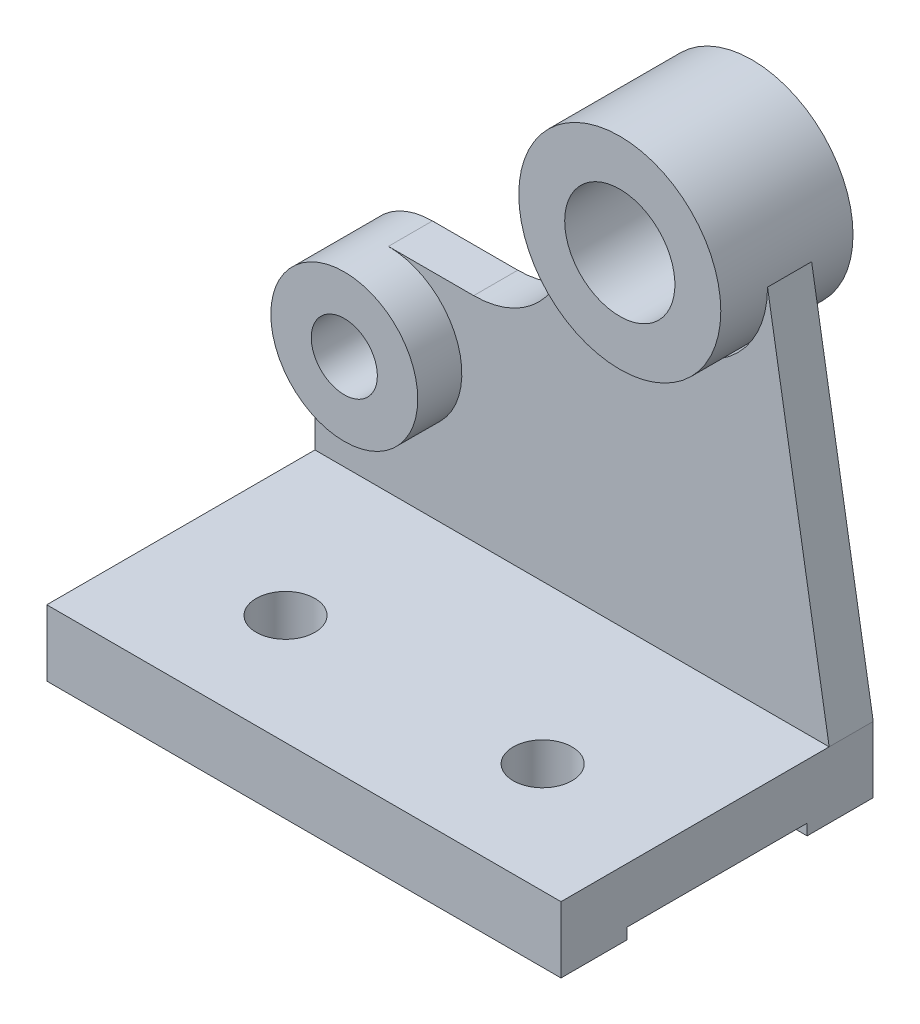
ISO-10303-21;
HEADER;
FILE_DESCRIPTION(('STEP AP214'),'2;1');
FILE_NAME('part.step','',(''),(''),'','','');
FILE_SCHEMA(('AUTOMOTIVE_DESIGN { 1 0 10303 214 1 1 1 1 }'));
ENDSEC;
DATA;
#1=APPLICATION_CONTEXT('core data for automotive mechanical design processes');
#2=APPLICATION_PROTOCOL_DEFINITION('international standard','automotive_design',2000,#1);
#3=PRODUCT_CONTEXT('',#1,'mechanical');
#4=PRODUCT('Part','Part','',(#3));
#5=PRODUCT_RELATED_PRODUCT_CATEGORY('part','',(#4));
#6=PRODUCT_DEFINITION_FORMATION('','',#4);
#7=PRODUCT_DEFINITION_CONTEXT('part definition',#1,'design');
#8=PRODUCT_DEFINITION('design','',#6,#7);
#9=PRODUCT_DEFINITION_SHAPE('','',#8);
#10=(LENGTH_UNIT() NAMED_UNIT(*) SI_UNIT(.MILLI.,.METRE.));
#11=(NAMED_UNIT(*) PLANE_ANGLE_UNIT() SI_UNIT($,.RADIAN.));
#12=(NAMED_UNIT(*) SI_UNIT($,.STERADIAN.) SOLID_ANGLE_UNIT());
#13=UNCERTAINTY_MEASURE_WITH_UNIT(LENGTH_MEASURE(1.E-05),#10,'distance_accuracy_value','');
#14=(GEOMETRIC_REPRESENTATION_CONTEXT(3) GLOBAL_UNCERTAINTY_ASSIGNED_CONTEXT((#13)) GLOBAL_UNIT_ASSIGNED_CONTEXT((#10,
#11,#12)) REPRESENTATION_CONTEXT('',''));
#15=CARTESIAN_POINT('',(0.,0.,0.));
#16=DIRECTION('',(0.,0.,1.));
#17=DIRECTION('',(1.,0.,0.));
#18=AXIS2_PLACEMENT_3D('',#15,#16,#17);
#19=CARTESIAN_POINT('',(0.,0.,85.));
#20=DIRECTION('',(0.,1.,0.));
#21=DIRECTION('',(0.,0.,1.));
#22=AXIS2_PLACEMENT_3D('',#19,#20,#21);
#23=PLANE('',#22);
#24=DIRECTION('',(0.,0.,-1.));
#25=VECTOR('',#24,1.);
#26=CARTESIAN_POINT('',(140.,0.,85.));
#27=LINE('',#26,#25);
#28=CARTESIAN_POINT('',(140.,0.,18.));
#29=VERTEX_POINT('',#28);
#30=CARTESIAN_POINT('',(140.,0.,0.));
#31=VERTEX_POINT('',#30);
#32=EDGE_CURVE('E174',#29,#31,#27,.T.);
#33=ORIENTED_EDGE('',*,*,#32,.F.);
#34=DIRECTION('',(-1.,0.,0.));
#35=VECTOR('',#34,1.);
#36=CARTESIAN_POINT('',(140.,0.,18.));
#37=LINE('',#36,#35);
#38=CARTESIAN_POINT('',(0.,0.,18.));
#39=VERTEX_POINT('',#38);
#40=EDGE_CURVE('E313',#29,#39,#37,.T.);
#41=ORIENTED_EDGE('',*,*,#40,.T.);
#42=DIRECTION('',(0.,0.,-1.));
#43=VECTOR('',#42,1.);
#44=CARTESIAN_POINT('',(0.,0.,85.));
#45=LINE('',#44,#43);
#46=CARTESIAN_POINT('',(0.,0.,0.));
#47=VERTEX_POINT('',#46);
#48=EDGE_CURVE('E293',#39,#47,#45,.T.);
#49=ORIENTED_EDGE('',*,*,#48,.T.);
#50=DIRECTION('',(1.,0.,0.));
#51=VECTOR('',#50,1.);
#52=CARTESIAN_POINT('',(0.,0.,0.));
#53=LINE('',#52,#51);
#54=EDGE_CURVE('E278',#47,#31,#53,.T.);
#55=ORIENTED_EDGE('',*,*,#54,.T.);
#56=EDGE_LOOP('',(#33,#41,#49,#55));
#57=FACE_BOUND('',#56,.T.);
#58=ADVANCED_FACE('F37',(#57),#23,.F.);
#59=CARTESIAN_POINT('',(95.728006970458,118.,12.));
#60=DIRECTION('',(0.,0.,-1.));
#61=DIRECTION('',(-1.,0.,0.));
#62=AXIS2_PLACEMENT_3D('',#59,#60,#61);
#63=CYLINDRICAL_SURFACE('',#62,27.5);
#64=CARTESIAN_POINT('',(95.728006970458,118.,0.));
#65=DIRECTION('',(0.,0.,1.));
#66=DIRECTION('',(1.,0.,0.));
#67=AXIS2_PLACEMENT_3D('',#64,#65,#66);
#68=CIRCLE('',#67,27.5);
#69=CARTESIAN_POINT('',(95.36400348523,90.5024091698429,0.));
#70=VERTEX_POINT('',#69);
#71=CARTESIAN_POINT('',(123.228006970458,118.,0.));
#72=VERTEX_POINT('',#71);
#73=EDGE_CURVE('E225',#70,#72,#68,.T.);
#74=ORIENTED_EDGE('',*,*,#73,.F.);
#75=DIRECTION('',(0.,0.,1.));
#76=VECTOR('',#75,1.);
#77=CARTESIAN_POINT('',(95.36400348523,90.5024091698429,6.));
#78=LINE('',#77,#76);
#79=CARTESIAN_POINT('',(95.36400348523,90.5024091698429,12.));
#80=VERTEX_POINT('',#79);
#81=EDGE_CURVE('E272',#70,#80,#78,.T.);
#82=ORIENTED_EDGE('',*,*,#81,.T.);
#83=CARTESIAN_POINT('',(95.728006970458,118.,12.));
#84=DIRECTION('',(0.,0.,1.));
#85=DIRECTION('',(1.,0.,0.));
#86=AXIS2_PLACEMENT_3D('',#83,#84,#85);
#87=CIRCLE('',#86,27.5);
#88=CARTESIAN_POINT('',(123.228006970458,118.,12.));
#89=VERTEX_POINT('',#88);
#90=EDGE_CURVE('E209',#80,#89,#87,.T.);
#91=ORIENTED_EDGE('',*,*,#90,.T.);
#92=DIRECTION('',(0.,0.,-1.));
#93=VECTOR('',#92,1.);
#94=CARTESIAN_POINT('',(123.228006970458,118.,12.));
#95=LINE('',#94,#93);
#96=EDGE_CURVE('E230',#89,#72,#95,.T.);
#97=ORIENTED_EDGE('',*,*,#96,.T.);
#98=EDGE_LOOP('',(#74,#82,#91,#97));
#99=FACE_BOUND('',#98,.T.);
#100=ADVANCED_FACE('F271',(#99),#63,.F.);
#101=CARTESIAN_POINT('',(68.228006970458,0.,12.));
#102=DIRECTION('',(1.,0.,0.));
#103=DIRECTION('',(0.,0.,-1.));
#104=AXIS2_PLACEMENT_3D('',#101,#102,#103);
#105=PLANE('',#104);
#106=DIRECTION('',(0.,0.,1.));
#107=VECTOR('',#106,1.);
#108=CARTESIAN_POINT('',(68.228006970458,111.714270986898,-12.));
#109=LINE('',#108,#107);
#110=CARTESIAN_POINT('',(68.228006970458,111.714270986898,0.));
#111=VERTEX_POINT('',#110);
#112=CARTESIAN_POINT('',(68.228006970458,111.714270986898,12.));
#113=VERTEX_POINT('',#112);
#114=EDGE_CURVE('E266',#111,#113,#109,.T.);
#115=ORIENTED_EDGE('',*,*,#114,.F.);
#116=DIRECTION('',(0.,-1.,0.));
#117=VECTOR('',#116,1.);
#118=CARTESIAN_POINT('',(68.228006970458,0.,0.));
#119=LINE('',#118,#117);
#120=CARTESIAN_POINT('',(68.228006970458,101.,0.));
#121=VERTEX_POINT('',#120);
#122=EDGE_CURVE('E195',#111,#121,#119,.T.);
#123=ORIENTED_EDGE('',*,*,#122,.T.);
#124=DIRECTION('',(0.,0.,-1.));
#125=VECTOR('',#124,1.);
#126=CARTESIAN_POINT('',(68.228006970458,101.,12.));
#127=LINE('',#126,#125);
#128=CARTESIAN_POINT('',(68.228006970458,101.,12.));
#129=VERTEX_POINT('',#128);
#130=EDGE_CURVE('E213',#129,#121,#127,.T.);
#131=ORIENTED_EDGE('',*,*,#130,.F.);
#132=DIRECTION('',(0.,-1.,0.));
#133=VECTOR('',#132,1.);
#134=CARTESIAN_POINT('',(68.228006970458,0.,12.));
#135=LINE('',#134,#133);
#136=EDGE_CURVE('E211',#113,#129,#135,.T.);
#137=ORIENTED_EDGE('',*,*,#136,.F.);
#138=EDGE_LOOP('',(#115,#123,#131,#137));
#139=FACE_BOUND('',#138,.T.);
#140=ADVANCED_FACE('F265',(#139),#105,.F.);
#141=CARTESIAN_POINT('',(43.228006970458,101.,12.));
#142=DIRECTION('',(0.,0.,-1.));
#143=DIRECTION('',(-1.,0.,0.));
#144=AXIS2_PLACEMENT_3D('',#141,#142,#143);
#145=CYLINDRICAL_SURFACE('',#144,25.);
#146=CARTESIAN_POINT('',(43.228006970458,101.,0.));
#147=DIRECTION('',(0.,0.,1.));
#148=DIRECTION('',(1.,0.,0.));
#149=AXIS2_PLACEMENT_3D('',#146,#147,#148);
#150=CIRCLE('',#149,25.);
#151=CARTESIAN_POINT('',(43.228006970458,76.,0.));
#152=VERTEX_POINT('',#151);
#153=EDGE_CURVE('E188',#152,#121,#150,.T.);
#154=ORIENTED_EDGE('',*,*,#153,.F.);
#155=DIRECTION('',(0.,0.,-1.));
#156=VECTOR('',#155,1.);
#157=CARTESIAN_POINT('',(43.228006970458,76.,12.));
#158=LINE('',#157,#156);
#159=CARTESIAN_POINT('',(43.228006970458,76.,12.));
#160=VERTEX_POINT('',#159);
#161=EDGE_CURVE('E46',#160,#152,#158,.T.);
#162=ORIENTED_EDGE('',*,*,#161,.F.);
#163=CARTESIAN_POINT('',(43.228006970458,101.,12.));
#164=DIRECTION('',(0.,0.,1.));
#165=DIRECTION('',(1.,0.,0.));
#166=AXIS2_PLACEMENT_3D('',#163,#164,#165);
#167=CIRCLE('',#166,25.);
#168=EDGE_CURVE('E191',#160,#129,#167,.T.);
#169=ORIENTED_EDGE('',*,*,#168,.T.);
#170=ORIENTED_EDGE('',*,*,#130,.T.);
#171=EDGE_LOOP('',(#154,#162,#169,#170));
#172=FACE_BOUND('',#171,.T.);
#173=ADVANCED_FACE('F39',(#172),#145,.F.);
#174=CARTESIAN_POINT('',(0.,76.,12.));
#175=DIRECTION('',(0.,1.,0.));
#176=DIRECTION('',(0.,0.,1.));
#177=AXIS2_PLACEMENT_3D('',#174,#175,#176);
#178=PLANE('',#177);
#179=DIRECTION('',(1.,0.,0.));
#180=VECTOR('',#179,1.);
#181=CARTESIAN_POINT('',(0.,76.,0.));
#182=LINE('',#181,#180);
#183=CARTESIAN_POINT('',(20.,76.,0.));
#184=VERTEX_POINT('',#183);
#185=EDGE_CURVE('E216',#184,#152,#182,.T.);
#186=ORIENTED_EDGE('',*,*,#185,.F.);
#187=DIRECTION('',(0.,0.,-1.));
#188=VECTOR('',#187,1.);
#189=CARTESIAN_POINT('',(20.,76.,12.));
#190=LINE('',#189,#188);
#191=CARTESIAN_POINT('',(20.,76.,12.));
#192=VERTEX_POINT('',#191);
#193=EDGE_CURVE('E239',#192,#184,#190,.T.);
#194=ORIENTED_EDGE('',*,*,#193,.F.);
#195=DIRECTION('',(1.,0.,0.));
#196=VECTOR('',#195,1.);
#197=CARTESIAN_POINT('',(0.,76.,12.));
#198=LINE('',#197,#196);
#199=EDGE_CURVE('E194',#192,#160,#198,.T.);
#200=ORIENTED_EDGE('',*,*,#199,.T.);
#201=ORIENTED_EDGE('',*,*,#161,.T.);
#202=EDGE_LOOP('',(#186,#194,#200,#201));
#203=FACE_BOUND('',#202,.T.);
#204=ADVANCED_FACE('F245',(#203),#178,.T.);
#205=CARTESIAN_POINT('',(0.,0.,12.));
#206=DIRECTION('',(-1.,0.,0.));
#207=DIRECTION('',(0.,0.,1.));
#208=AXIS2_PLACEMENT_3D('',#205,#206,#207);
#209=PLANE('',#208);
#210=DIRECTION('',(0.,-1.,0.));
#211=VECTOR('',#210,1.);
#212=CARTESIAN_POINT('',(0.,0.,18.));
#213=LINE('',#212,#211);
#214=CARTESIAN_POINT('',(0.,3.,18.));
#215=VERTEX_POINT('',#214);
#216=EDGE_CURVE('E157',#215,#39,#213,.T.);
#217=ORIENTED_EDGE('',*,*,#216,.F.);
#218=DIRECTION('',(0.,0.,-1.));
#219=VECTOR('',#218,1.);
#220=CARTESIAN_POINT('',(0.,3.,18.));
#221=LINE('',#220,#219);
#222=CARTESIAN_POINT('',(0.,3.,67.));
#223=VERTEX_POINT('',#222);
#224=EDGE_CURVE('E388',#223,#215,#221,.T.);
#225=ORIENTED_EDGE('',*,*,#224,.F.);
#226=DIRECTION('',(0.,1.,0.));
#227=VECTOR('',#226,1.);
#228=CARTESIAN_POINT('',(0.,3.,67.));
#229=LINE('',#228,#227);
#230=CARTESIAN_POINT('',(0.,0.,67.));
#231=VERTEX_POINT('',#230);
#232=EDGE_CURVE('E390',#231,#223,#229,.T.);
#233=ORIENTED_EDGE('',*,*,#232,.F.);
#234=CARTESIAN_POINT('',(0.,0.,85.));
#235=VERTEX_POINT('',#234);
#236=EDGE_CURVE('E166',#235,#231,#45,.T.);
#237=ORIENTED_EDGE('',*,*,#236,.F.);
#238=DIRECTION('',(0.,-1.,0.));
#239=VECTOR('',#238,1.);
#240=CARTESIAN_POINT('',(0.,0.,85.));
#241=LINE('',#240,#239);
#242=CARTESIAN_POINT('',(0.,18.,85.));
#243=VERTEX_POINT('',#242);
#244=EDGE_CURVE('E291',#243,#235,#241,.T.);
#245=ORIENTED_EDGE('',*,*,#244,.F.);
#246=DIRECTION('',(0.,0.,-1.));
#247=VECTOR('',#246,1.);
#248=CARTESIAN_POINT('',(0.,18.,85.));
#249=LINE('',#248,#247);
#250=CARTESIAN_POINT('',(0.,18.,12.));
#251=VERTEX_POINT('',#250);
#252=EDGE_CURVE('E297',#243,#251,#249,.T.);
#253=ORIENTED_EDGE('',*,*,#252,.T.);
#254=DIRECTION('',(0.,1.,0.));
#255=VECTOR('',#254,1.);
#256=CARTESIAN_POINT('',(0.,0.,12.));
#257=LINE('',#256,#255);
#258=CARTESIAN_POINT('',(0.,56.,12.));
#259=VERTEX_POINT('',#258);
#260=EDGE_CURVE('E200',#251,#259,#257,.T.);
#261=ORIENTED_EDGE('',*,*,#260,.T.);
#262=DIRECTION('',(0.,0.,-1.));
#263=VECTOR('',#262,1.);
#264=CARTESIAN_POINT('',(0.,56.,12.));
#265=LINE('',#264,#263);
#266=CARTESIAN_POINT('',(0.,56.,0.));
#267=VERTEX_POINT('',#266);
#268=EDGE_CURVE('E236',#259,#267,#265,.T.);
#269=ORIENTED_EDGE('',*,*,#268,.T.);
#270=DIRECTION('',(0.,1.,0.));
#271=VECTOR('',#270,1.);
#272=CARTESIAN_POINT('',(0.,0.,0.));
#273=LINE('',#272,#271);
#274=EDGE_CURVE('E219',#47,#267,#273,.T.);
#275=ORIENTED_EDGE('',*,*,#274,.F.);
#276=ORIENTED_EDGE('',*,*,#48,.F.);
#277=EDGE_LOOP('',(#217,#225,#233,#237,#245,#253,#261,#269,#275,#276));
#278=FACE_BOUND('',#277,.T.);
#279=ADVANCED_FACE('F315',(#278),#209,.T.);
#280=CARTESIAN_POINT('',(139.105912890801,23.330834013726,12.));
#281=DIRECTION('',(0.986224959312359,0.165409581431473,0.));
#282=DIRECTION('',(-0.165409581431473,0.98622495931236,0.));
#283=AXIS2_PLACEMENT_3D('',#280,#281,#282);
#284=PLANE('',#283);
#285=DIRECTION('',(0.165409581431473,-0.986224959312359,0.));
#286=VECTOR('',#285,1.);
#287=CARTESIAN_POINT('',(139.105912890801,23.330834013726,0.));
#288=LINE('',#287,#286);
#289=CARTESIAN_POINT('',(140.,18.,0.));
#290=VERTEX_POINT('',#289);
#291=EDGE_CURVE('E222',#72,#290,#288,.T.);
#292=ORIENTED_EDGE('',*,*,#291,.F.);
#293=ORIENTED_EDGE('',*,*,#96,.F.);
#294=DIRECTION('',(0.165409581431473,-0.986224959312359,0.));
#295=VECTOR('',#294,1.);
#296=CARTESIAN_POINT('',(139.105912890801,23.330834013726,12.));
#297=LINE('',#296,#295);
#298=CARTESIAN_POINT('',(140.,18.,12.));
#299=VERTEX_POINT('',#298);
#300=EDGE_CURVE('E206',#89,#299,#297,.T.);
#301=ORIENTED_EDGE('',*,*,#300,.T.);
#302=DIRECTION('',(0.,0.,-1.));
#303=VECTOR('',#302,1.);
#304=CARTESIAN_POINT('',(140.,18.,12.));
#305=LINE('',#304,#303);
#306=EDGE_CURVE('E233',#299,#290,#305,.T.);
#307=ORIENTED_EDGE('',*,*,#306,.T.);
#308=EDGE_LOOP('',(#292,#293,#301,#307));
#309=FACE_BOUND('',#308,.T.);
#310=ADVANCED_FACE('F308',(#309),#284,.T.);
#311=CARTESIAN_POINT('',(0.,0.,12.));
#312=DIRECTION('',(0.,0.,1.));
#313=DIRECTION('',(1.,0.,0.));
#314=AXIS2_PLACEMENT_3D('',#311,#312,#313);
#315=PLANE('',#314);
#316=ORIENTED_EDGE('',*,*,#90,.F.);
#317=CARTESIAN_POINT('',(95.,118.,12.));
#318=DIRECTION('',(0.,0.,1.));
#319=DIRECTION('',(1.,0.,0.));
#320=AXIS2_PLACEMENT_3D('',#317,#318,#319);
#321=CIRCLE('',#320,27.5);
#322=EDGE_CURVE('E61',#80,#113,#321,.F.);
#323=ORIENTED_EDGE('',*,*,#322,.T.);
#324=ORIENTED_EDGE('',*,*,#136,.T.);
#325=ORIENTED_EDGE('',*,*,#168,.F.);
#326=ORIENTED_EDGE('',*,*,#199,.F.);
#327=CARTESIAN_POINT('',(20.,56.,12.));
#328=DIRECTION('',(0.,0.,1.));
#329=DIRECTION('',(1.,0.,0.));
#330=AXIS2_PLACEMENT_3D('',#327,#328,#329);
#331=CIRCLE('',#330,20.);
#332=EDGE_CURVE('E198',#259,#192,#331,.T.);
#333=ORIENTED_EDGE('',*,*,#332,.F.);
#334=ORIENTED_EDGE('',*,*,#260,.F.);
#335=DIRECTION('',(1.,0.,0.));
#336=VECTOR('',#335,1.);
#337=CARTESIAN_POINT('',(0.,18.,12.));
#338=LINE('',#337,#336);
#339=EDGE_CURVE('E203',#251,#299,#338,.T.);
#340=ORIENTED_EDGE('',*,*,#339,.T.);
#341=ORIENTED_EDGE('',*,*,#300,.F.);
#342=EDGE_LOOP('',(#316,#323,#324,#325,#326,#333,#334,#340,#341));
#343=FACE_BOUND('',#342,.T.);
#344=ADVANCED_FACE('F260',(#343),#315,.T.);
#345=CARTESIAN_POINT('',(0.,0.,0.));
#346=DIRECTION('',(0.,0.,1.));
#347=DIRECTION('',(1.,0.,0.));
#348=AXIS2_PLACEMENT_3D('',#345,#346,#347);
#349=PLANE('',#348);
#350=CARTESIAN_POINT('',(95.,118.,0.));
#351=DIRECTION('',(0.,0.,1.));
#352=DIRECTION('',(1.,0.,0.));
#353=AXIS2_PLACEMENT_3D('',#350,#351,#352);
#354=CIRCLE('',#353,27.5);
#355=EDGE_CURVE('E11',#70,#111,#354,.F.);
#356=ORIENTED_EDGE('',*,*,#355,.F.);
#357=ORIENTED_EDGE('',*,*,#73,.T.);
#358=ORIENTED_EDGE('',*,*,#291,.T.);
#359=DIRECTION('',(0.,1.,0.));
#360=VECTOR('',#359,1.);
#361=CARTESIAN_POINT('',(140.,0.,0.));
#362=LINE('',#361,#360);
#363=EDGE_CURVE('E286',#31,#290,#362,.T.);
#364=ORIENTED_EDGE('',*,*,#363,.F.);
#365=ORIENTED_EDGE('',*,*,#54,.F.);
#366=ORIENTED_EDGE('',*,*,#274,.T.);
#367=CARTESIAN_POINT('',(20.,56.,0.));
#368=DIRECTION('',(0.,0.,1.));
#369=DIRECTION('',(1.,0.,0.));
#370=AXIS2_PLACEMENT_3D('',#367,#368,#369);
#371=CIRCLE('',#370,20.);
#372=EDGE_CURVE('E177',#184,#267,#371,.T.);
#373=ORIENTED_EDGE('',*,*,#372,.F.);
#374=ORIENTED_EDGE('',*,*,#185,.T.);
#375=ORIENTED_EDGE('',*,*,#153,.T.);
#376=ORIENTED_EDGE('',*,*,#122,.F.);
#377=EDGE_LOOP('',(#356,#357,#358,#364,#365,#366,#373,#374,#375,#376));
#378=FACE_BOUND('',#377,.T.);
#379=CARTESIAN_POINT('',(20.,56.,0.));
#380=DIRECTION('',(0.,0.,1.));
#381=DIRECTION('',(1.,0.,0.));
#382=AXIS2_PLACEMENT_3D('',#379,#380,#381);
#383=CIRCLE('',#382,9.);
#384=CARTESIAN_POINT('',(29.,56.,0.));
#385=VERTEX_POINT('',#384);
#386=EDGE_CURVE('E173',#385,#385,#383,.T.);
#387=ORIENTED_EDGE('',*,*,#386,.T.);
#388=EDGE_LOOP('',(#387));
#389=FACE_BOUND('',#388,.T.);
#390=ADVANCED_FACE('F252',(#378,#389),#349,.F.);
#391=CARTESIAN_POINT('',(20.,56.,24.));
#392=DIRECTION('',(0.,0.,-1.));
#393=DIRECTION('',(-1.,0.,0.));
#394=AXIS2_PLACEMENT_3D('',#391,#392,#393);
#395=CYLINDRICAL_SURFACE('',#394,9.);
#396=CARTESIAN_POINT('',(20.,56.,24.));
#397=DIRECTION('',(0.,0.,1.));
#398=DIRECTION('',(1.,0.,0.));
#399=AXIS2_PLACEMENT_3D('',#396,#397,#398);
#400=CIRCLE('',#399,9.);
#401=CARTESIAN_POINT('',(29.,56.,24.));
#402=VERTEX_POINT('',#401);
#403=EDGE_CURVE('E183',#402,#402,#400,.T.);
#404=ORIENTED_EDGE('',*,*,#403,.T.);
#405=EDGE_LOOP('',(#404));
#406=FACE_BOUND('',#405,.T.);
#407=ORIENTED_EDGE('',*,*,#386,.F.);
#408=EDGE_LOOP('',(#407));
#409=FACE_BOUND('',#408,.T.);
#410=ADVANCED_FACE('F550',(#406,#409),#395,.F.);
#411=CARTESIAN_POINT('',(20.,56.,24.));
#412=DIRECTION('',(0.,0.,-1.));
#413=DIRECTION('',(-1.,0.,0.));
#414=AXIS2_PLACEMENT_3D('',#411,#412,#413);
#415=CYLINDRICAL_SURFACE('',#414,20.);
#416=ORIENTED_EDGE('',*,*,#193,.T.);
#417=ORIENTED_EDGE('',*,*,#372,.T.);
#418=ORIENTED_EDGE('',*,*,#268,.F.);
#419=ORIENTED_EDGE('',*,*,#332,.T.);
#420=EDGE_LOOP('',(#416,#417,#418,#419));
#421=FACE_BOUND('',#420,.T.);
#422=CARTESIAN_POINT('',(20.,56.,24.));
#423=DIRECTION('',(0.,0.,1.));
#424=DIRECTION('',(1.,0.,0.));
#425=AXIS2_PLACEMENT_3D('',#422,#423,#424);
#426=CIRCLE('',#425,20.);
#427=CARTESIAN_POINT('',(40.,56.,24.));
#428=VERTEX_POINT('',#427);
#429=EDGE_CURVE('E186',#428,#428,#426,.T.);
#430=ORIENTED_EDGE('',*,*,#429,.F.);
#431=EDGE_LOOP('',(#430));
#432=FACE_BOUND('',#431,.T.);
#433=ADVANCED_FACE('F257',(#421,#432),#415,.T.);
#434=CARTESIAN_POINT('',(0.,0.,24.));
#435=DIRECTION('',(0.,0.,1.));
#436=DIRECTION('',(1.,0.,0.));
#437=AXIS2_PLACEMENT_3D('',#434,#435,#436);
#438=PLANE('',#437);
#439=ORIENTED_EDGE('',*,*,#403,.F.);
#440=EDGE_LOOP('',(#439));
#441=FACE_BOUND('',#440,.T.);
#442=ORIENTED_EDGE('',*,*,#429,.T.);
#443=EDGE_LOOP('',(#442));
#444=FACE_BOUND('',#443,.T.);
#445=ADVANCED_FACE('F338',(#441,#444),#438,.T.);
#446=CARTESIAN_POINT('',(0.,18.,85.));
#447=DIRECTION('',(0.,1.,0.));
#448=DIRECTION('',(0.,0.,1.));
#449=AXIS2_PLACEMENT_3D('',#446,#447,#448);
#450=PLANE('',#449);
#451=CARTESIAN_POINT('',(105.,18.,55.));
#452=DIRECTION('',(0.,1.,0.));
#453=DIRECTION('',(0.,0.,1.));
#454=AXIS2_PLACEMENT_3D('',#451,#452,#453);
#455=CIRCLE('',#454,8.);
#456=CARTESIAN_POINT('',(105.,18.,63.));
#457=VERTEX_POINT('',#456);
#458=EDGE_CURVE('E401',#457,#457,#455,.T.);
#459=ORIENTED_EDGE('',*,*,#458,.F.);
#460=EDGE_LOOP('',(#459));
#461=FACE_BOUND('',#460,.T.);
#462=CARTESIAN_POINT('',(35.,18.,55.));
#463=DIRECTION('',(0.,1.,0.));
#464=DIRECTION('',(0.,0.,1.));
#465=AXIS2_PLACEMENT_3D('',#462,#463,#464);
#466=CIRCLE('',#465,8.);
#467=CARTESIAN_POINT('',(35.,18.,63.));
#468=VERTEX_POINT('',#467);
#469=EDGE_CURVE('E400',#468,#468,#466,.T.);
#470=ORIENTED_EDGE('',*,*,#469,.F.);
#471=EDGE_LOOP('',(#470));
#472=FACE_BOUND('',#471,.T.);
#473=ORIENTED_EDGE('',*,*,#339,.F.);
#474=ORIENTED_EDGE('',*,*,#252,.F.);
#475=DIRECTION('',(1.,0.,0.));
#476=VECTOR('',#475,1.);
#477=CARTESIAN_POINT('',(0.,18.,85.));
#478=LINE('',#477,#476);
#479=CARTESIAN_POINT('',(140.,18.,85.));
#480=VERTEX_POINT('',#479);
#481=EDGE_CURVE('E288',#243,#480,#478,.T.);
#482=ORIENTED_EDGE('',*,*,#481,.T.);
#483=DIRECTION('',(0.,0.,-1.));
#484=VECTOR('',#483,1.);
#485=CARTESIAN_POINT('',(140.,18.,85.));
#486=LINE('',#485,#484);
#487=EDGE_CURVE('E179',#480,#299,#486,.T.);
#488=ORIENTED_EDGE('',*,*,#487,.T.);
#489=EDGE_LOOP('',(#473,#474,#482,#488));
#490=FACE_BOUND('',#489,.T.);
#491=ADVANCED_FACE('F303',(#461,#472,#490),#450,.T.);
#492=ORIENTED_EDGE('',*,*,#236,.T.);
#493=DIRECTION('',(-1.,0.,0.));
#494=VECTOR('',#493,1.);
#495=CARTESIAN_POINT('',(140.,0.,67.));
#496=LINE('',#495,#494);
#497=CARTESIAN_POINT('',(140.,0.,67.));
#498=VERTEX_POINT('',#497);
#499=EDGE_CURVE('E152',#498,#231,#496,.T.);
#500=ORIENTED_EDGE('',*,*,#499,.F.);
#501=CARTESIAN_POINT('',(140.,0.,85.));
#502=VERTEX_POINT('',#501);
#503=EDGE_CURVE('E164',#502,#498,#27,.T.);
#504=ORIENTED_EDGE('',*,*,#503,.F.);
#505=DIRECTION('',(1.,0.,0.));
#506=VECTOR('',#505,1.);
#507=CARTESIAN_POINT('',(0.,0.,85.));
#508=LINE('',#507,#506);
#509=EDGE_CURVE('E284',#235,#502,#508,.T.);
#510=ORIENTED_EDGE('',*,*,#509,.F.);
#511=EDGE_LOOP('',(#492,#500,#504,#510));
#512=FACE_BOUND('',#511,.T.);
#513=ADVANCED_FACE('F162',(#512),#23,.F.);
#514=CARTESIAN_POINT('',(140.,0.,85.));
#515=DIRECTION('',(-1.,0.,0.));
#516=DIRECTION('',(0.,0.,1.));
#517=AXIS2_PLACEMENT_3D('',#514,#515,#516);
#518=PLANE('',#517);
#519=DIRECTION('',(0.,0.,-1.));
#520=VECTOR('',#519,1.);
#521=CARTESIAN_POINT('',(140.,3.,18.));
#522=LINE('',#521,#520);
#523=CARTESIAN_POINT('',(140.,3.,67.));
#524=VERTEX_POINT('',#523);
#525=CARTESIAN_POINT('',(140.,3.,18.));
#526=VERTEX_POINT('',#525);
#527=EDGE_CURVE('E53',#524,#526,#522,.T.);
#528=ORIENTED_EDGE('',*,*,#527,.T.);
#529=DIRECTION('',(0.,-1.,0.));
#530=VECTOR('',#529,1.);
#531=CARTESIAN_POINT('',(140.,0.,18.));
#532=LINE('',#531,#530);
#533=EDGE_CURVE('E167',#526,#29,#532,.T.);
#534=ORIENTED_EDGE('',*,*,#533,.T.);
#535=ORIENTED_EDGE('',*,*,#32,.T.);
#536=ORIENTED_EDGE('',*,*,#363,.T.);
#537=ORIENTED_EDGE('',*,*,#306,.F.);
#538=ORIENTED_EDGE('',*,*,#487,.F.);
#539=DIRECTION('',(0.,1.,0.));
#540=VECTOR('',#539,1.);
#541=CARTESIAN_POINT('',(140.,0.,85.));
#542=LINE('',#541,#540);
#543=EDGE_CURVE('E171',#502,#480,#542,.T.);
#544=ORIENTED_EDGE('',*,*,#543,.F.);
#545=ORIENTED_EDGE('',*,*,#503,.T.);
#546=DIRECTION('',(0.,1.,0.));
#547=VECTOR('',#546,1.);
#548=CARTESIAN_POINT('',(140.,3.,67.));
#549=LINE('',#548,#547);
#550=EDGE_CURVE('E148',#498,#524,#549,.T.);
#551=ORIENTED_EDGE('',*,*,#550,.T.);
#552=EDGE_LOOP('',(#528,#534,#535,#536,#537,#538,#544,#545,#551));
#553=FACE_BOUND('',#552,.T.);
#554=ADVANCED_FACE('F169',(#553),#518,.F.);
#555=CARTESIAN_POINT('',(0.,0.,85.));
#556=DIRECTION('',(0.,0.,1.));
#557=DIRECTION('',(1.,0.,0.));
#558=AXIS2_PLACEMENT_3D('',#555,#556,#557);
#559=PLANE('',#558);
#560=ORIENTED_EDGE('',*,*,#509,.T.);
#561=ORIENTED_EDGE('',*,*,#543,.T.);
#562=ORIENTED_EDGE('',*,*,#481,.F.);
#563=ORIENTED_EDGE('',*,*,#244,.T.);
#564=EDGE_LOOP('',(#560,#561,#562,#563));
#565=FACE_BOUND('',#564,.T.);
#566=ADVANCED_FACE('F337',(#565),#559,.T.);
#567=CARTESIAN_POINT('',(95.,118.,-12.));
#568=DIRECTION('',(0.,0.,-1.));
#569=DIRECTION('',(-1.,0.,0.));
#570=AXIS2_PLACEMENT_3D('',#567,#568,#569);
#571=PLANE('',#570);
#572=CARTESIAN_POINT('',(95.,118.,-12.));
#573=DIRECTION('',(0.,0.,-1.));
#574=DIRECTION('',(-1.,0.,0.));
#575=AXIS2_PLACEMENT_3D('',#572,#573,#574);
#576=CIRCLE('',#575,27.5);
#577=CARTESIAN_POINT('',(67.5,118.,-12.));
#578=VERTEX_POINT('',#577);
#579=EDGE_CURVE('E280',#578,#578,#576,.T.);
#580=ORIENTED_EDGE('',*,*,#579,.T.);
#581=EDGE_LOOP('',(#580));
#582=FACE_BOUND('',#581,.T.);
#583=CARTESIAN_POINT('',(95.,118.,-12.));
#584=DIRECTION('',(0.,0.,-1.));
#585=DIRECTION('',(-1.,0.,0.));
#586=AXIS2_PLACEMENT_3D('',#583,#584,#585);
#587=CIRCLE('',#586,15.);
#588=CARTESIAN_POINT('',(80.,118.,-12.));
#589=VERTEX_POINT('',#588);
#590=EDGE_CURVE('E407',#589,#589,#587,.T.);
#591=ORIENTED_EDGE('',*,*,#590,.F.);
#592=EDGE_LOOP('',(#591));
#593=FACE_BOUND('',#592,.T.);
#594=ADVANCED_FACE('F350',(#582,#593),#571,.T.);
#595=CARTESIAN_POINT('',(95.,118.,24.));
#596=DIRECTION('',(0.,0.,-1.));
#597=DIRECTION('',(-1.,0.,0.));
#598=AXIS2_PLACEMENT_3D('',#595,#596,#597);
#599=PLANE('',#598);
#600=CARTESIAN_POINT('',(95.,118.,24.));
#601=DIRECTION('',(0.,0.,-1.));
#602=DIRECTION('',(-1.,0.,0.));
#603=AXIS2_PLACEMENT_3D('',#600,#601,#602);
#604=CIRCLE('',#603,27.5);
#605=CARTESIAN_POINT('',(67.5,118.,24.));
#606=VERTEX_POINT('',#605);
#607=EDGE_CURVE('E410',#606,#606,#604,.T.);
#608=ORIENTED_EDGE('',*,*,#607,.F.);
#609=EDGE_LOOP('',(#608));
#610=FACE_BOUND('',#609,.T.);
#611=CARTESIAN_POINT('',(95.,118.,24.));
#612=DIRECTION('',(0.,0.,-1.));
#613=DIRECTION('',(-1.,0.,0.));
#614=AXIS2_PLACEMENT_3D('',#611,#612,#613);
#615=CIRCLE('',#614,15.);
#616=CARTESIAN_POINT('',(80.,118.,24.));
#617=VERTEX_POINT('',#616);
#618=EDGE_CURVE('E404',#617,#617,#615,.T.);
#619=ORIENTED_EDGE('',*,*,#618,.T.);
#620=EDGE_LOOP('',(#619));
#621=FACE_BOUND('',#620,.T.);
#622=ADVANCED_FACE('F355',(#610,#621),#599,.F.);
#623=CARTESIAN_POINT('',(95.,118.,-12.));
#624=DIRECTION('',(0.,0.,1.));
#625=DIRECTION('',(1.,0.,0.));
#626=AXIS2_PLACEMENT_3D('',#623,#624,#625);
#627=CYLINDRICAL_SURFACE('',#626,27.5);
#628=ORIENTED_EDGE('',*,*,#322,.F.);
#629=ORIENTED_EDGE('',*,*,#81,.F.);
#630=ORIENTED_EDGE('',*,*,#355,.T.);
#631=ORIENTED_EDGE('',*,*,#114,.T.);
#632=EDGE_LOOP('',(#628,#629,#630,#631));
#633=FACE_BOUND('',#632,.T.);
#634=ORIENTED_EDGE('',*,*,#579,.F.);
#635=EDGE_LOOP('',(#634));
#636=FACE_BOUND('',#635,.T.);
#637=ORIENTED_EDGE('',*,*,#607,.T.);
#638=EDGE_LOOP('',(#637));
#639=FACE_BOUND('',#638,.T.);
#640=ADVANCED_FACE('F275',(#633,#636,#639),#627,.T.);
#641=CARTESIAN_POINT('',(95.,118.,-12.));
#642=DIRECTION('',(0.,0.,1.));
#643=DIRECTION('',(1.,0.,0.));
#644=AXIS2_PLACEMENT_3D('',#641,#642,#643);
#645=CYLINDRICAL_SURFACE('',#644,15.);
#646=ORIENTED_EDGE('',*,*,#590,.T.);
#647=EDGE_LOOP('',(#646));
#648=FACE_BOUND('',#647,.T.);
#649=ORIENTED_EDGE('',*,*,#618,.F.);
#650=EDGE_LOOP('',(#649));
#651=FACE_BOUND('',#650,.T.);
#652=ADVANCED_FACE('F354',(#648,#651),#645,.F.);
#653=CARTESIAN_POINT('',(35.,0.,55.));
#654=DIRECTION('',(0.,1.,0.));
#655=DIRECTION('',(0.,0.,1.));
#656=AXIS2_PLACEMENT_3D('',#653,#654,#655);
#657=CYLINDRICAL_SURFACE('',#656,8.);
#658=CARTESIAN_POINT('',(35.,3.,55.));
#659=DIRECTION('',(0.,1.,0.));
#660=DIRECTION('',(0.,0.,1.));
#661=AXIS2_PLACEMENT_3D('',#658,#659,#660);
#662=CIRCLE('',#661,8.);
#663=CARTESIAN_POINT('',(35.,3.,63.));
#664=VERTEX_POINT('',#663);
#665=EDGE_CURVE('E397',#664,#664,#662,.F.);
#666=ORIENTED_EDGE('',*,*,#665,.T.);
#667=EDGE_LOOP('',(#666));
#668=FACE_BOUND('',#667,.T.);
#669=ORIENTED_EDGE('',*,*,#469,.T.);
#670=EDGE_LOOP('',(#669));
#671=FACE_BOUND('',#670,.T.);
#672=ADVANCED_FACE('F364',(#668,#671),#657,.F.);
#673=CARTESIAN_POINT('',(105.,0.,55.));
#674=DIRECTION('',(0.,1.,0.));
#675=DIRECTION('',(0.,0.,1.));
#676=AXIS2_PLACEMENT_3D('',#673,#674,#675);
#677=CYLINDRICAL_SURFACE('',#676,8.);
#678=CARTESIAN_POINT('',(105.,3.,55.));
#679=DIRECTION('',(0.,1.,0.));
#680=DIRECTION('',(0.,0.,1.));
#681=AXIS2_PLACEMENT_3D('',#678,#679,#680);
#682=CIRCLE('',#681,8.);
#683=CARTESIAN_POINT('',(105.,3.,63.));
#684=VERTEX_POINT('',#683);
#685=EDGE_CURVE('E41',#684,#684,#682,.F.);
#686=ORIENTED_EDGE('',*,*,#685,.T.);
#687=EDGE_LOOP('',(#686));
#688=FACE_BOUND('',#687,.T.);
#689=ORIENTED_EDGE('',*,*,#458,.T.);
#690=EDGE_LOOP('',(#689));
#691=FACE_BOUND('',#690,.T.);
#692=ADVANCED_FACE('F368',(#688,#691),#677,.F.);
#693=CARTESIAN_POINT('',(140.,3.,18.));
#694=DIRECTION('',(0.,1.,0.));
#695=DIRECTION('',(0.,0.,1.));
#696=AXIS2_PLACEMENT_3D('',#693,#694,#695);
#697=PLANE('',#696);
#698=ORIENTED_EDGE('',*,*,#685,.F.);
#699=EDGE_LOOP('',(#698));
#700=FACE_BOUND('',#699,.T.);
#701=ORIENTED_EDGE('',*,*,#224,.T.);
#702=DIRECTION('',(-1.,0.,0.));
#703=VECTOR('',#702,1.);
#704=CARTESIAN_POINT('',(140.,3.,18.));
#705=LINE('',#704,#703);
#706=EDGE_CURVE('E386',#526,#215,#705,.T.);
#707=ORIENTED_EDGE('',*,*,#706,.F.);
#708=ORIENTED_EDGE('',*,*,#527,.F.);
#709=DIRECTION('',(-1.,0.,0.));
#710=VECTOR('',#709,1.);
#711=CARTESIAN_POINT('',(140.,3.,67.));
#712=LINE('',#711,#710);
#713=EDGE_CURVE('E154',#524,#223,#712,.T.);
#714=ORIENTED_EDGE('',*,*,#713,.T.);
#715=EDGE_LOOP('',(#701,#707,#708,#714));
#716=FACE_BOUND('',#715,.T.);
#717=ORIENTED_EDGE('',*,*,#665,.F.);
#718=EDGE_LOOP('',(#717));
#719=FACE_BOUND('',#718,.T.);
#720=ADVANCED_FACE('F372',(#700,#716,#719),#697,.F.);
#721=CARTESIAN_POINT('',(140.,0.,18.));
#722=DIRECTION('',(0.,0.,-1.));
#723=DIRECTION('',(-1.,0.,0.));
#724=AXIS2_PLACEMENT_3D('',#721,#722,#723);
#725=PLANE('',#724);
#726=ORIENTED_EDGE('',*,*,#216,.T.);
#727=ORIENTED_EDGE('',*,*,#40,.F.);
#728=ORIENTED_EDGE('',*,*,#533,.F.);
#729=ORIENTED_EDGE('',*,*,#706,.T.);
#730=EDGE_LOOP('',(#726,#727,#728,#729));
#731=FACE_BOUND('',#730,.T.);
#732=ADVANCED_FACE('F376',(#731),#725,.F.);
#733=CARTESIAN_POINT('',(140.,3.,67.));
#734=DIRECTION('',(0.,0.,1.));
#735=DIRECTION('',(1.,0.,0.));
#736=AXIS2_PLACEMENT_3D('',#733,#734,#735);
#737=PLANE('',#736);
#738=ORIENTED_EDGE('',*,*,#232,.T.);
#739=ORIENTED_EDGE('',*,*,#713,.F.);
#740=ORIENTED_EDGE('',*,*,#550,.F.);
#741=ORIENTED_EDGE('',*,*,#499,.T.);
#742=EDGE_LOOP('',(#738,#739,#740,#741));
#743=FACE_BOUND('',#742,.T.);
#744=ADVANCED_FACE('F151',(#743),#737,.F.);
#745=CLOSED_SHELL('',(#58,#100,#140,#173,#204,#279,#310,#344,#390,#410,#433,#445,#491,#513,#554,
#566,#594,#622,#640,#652,#672,#692,#720,#732,#744));
#746=MANIFOLD_SOLID_BREP('B2',#745);
#747=ADVANCED_BREP_SHAPE_REPRESENTATION('',(#18,#746),#14);
#748=SHAPE_DEFINITION_REPRESENTATION(#9,#747);
ENDSEC;
END-ISO-10303-21;
